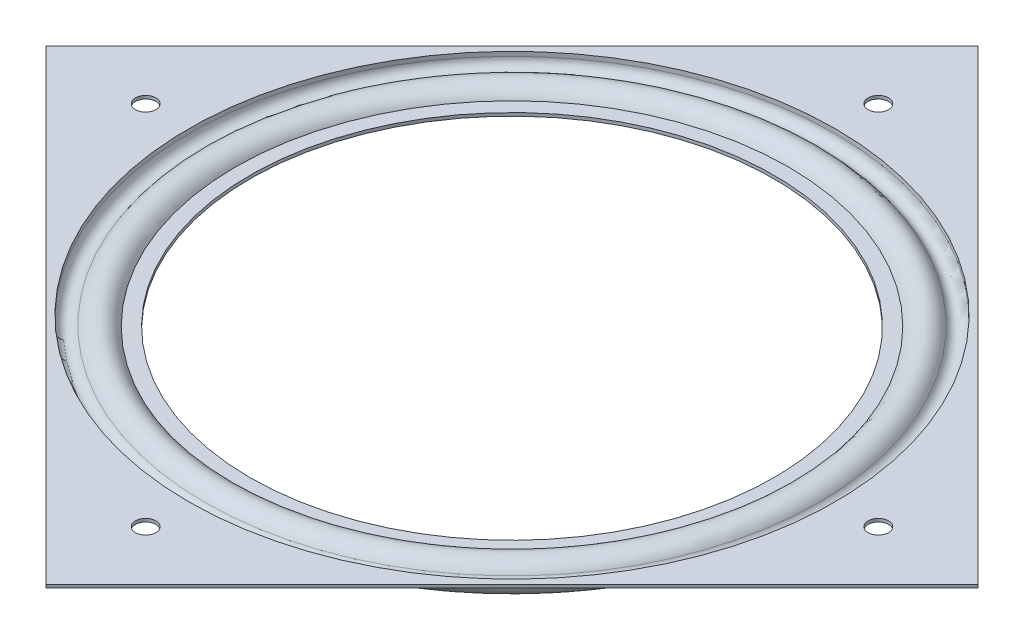
ISO-10303-21;
HEADER;
FILE_DESCRIPTION(('STEP AP214'),'2;1');
FILE_NAME('part.step','',(''),(''),'','','');
FILE_SCHEMA(('AUTOMOTIVE_DESIGN { 1 0 10303 214 1 1 1 1 }'));
ENDSEC;
DATA;
#1=APPLICATION_CONTEXT('core data for automotive mechanical design processes');
#2=APPLICATION_PROTOCOL_DEFINITION('international standard','automotive_design',2000,#1);
#3=PRODUCT_CONTEXT('',#1,'mechanical');
#4=PRODUCT('Part','Part','',(#3));
#5=PRODUCT_RELATED_PRODUCT_CATEGORY('part','',(#4));
#6=PRODUCT_DEFINITION_FORMATION('','',#4);
#7=PRODUCT_DEFINITION_CONTEXT('part definition',#1,'design');
#8=PRODUCT_DEFINITION('design','',#6,#7);
#9=PRODUCT_DEFINITION_SHAPE('','',#8);
#10=(LENGTH_UNIT() NAMED_UNIT(*) SI_UNIT(.MILLI.,.METRE.));
#11=(NAMED_UNIT(*) PLANE_ANGLE_UNIT() SI_UNIT($,.RADIAN.));
#12=(NAMED_UNIT(*) SI_UNIT($,.STERADIAN.) SOLID_ANGLE_UNIT());
#13=UNCERTAINTY_MEASURE_WITH_UNIT(LENGTH_MEASURE(1.E-05),#10,'distance_accuracy_value','');
#14=(GEOMETRIC_REPRESENTATION_CONTEXT(3) GLOBAL_UNCERTAINTY_ASSIGNED_CONTEXT((#13)) GLOBAL_UNIT_ASSIGNED_CONTEXT((#10,
#11,#12)) REPRESENTATION_CONTEXT('',''));
#15=CARTESIAN_POINT('',(0.,0.,0.));
#16=DIRECTION('',(0.,0.,1.));
#17=DIRECTION('',(1.,0.,0.));
#18=AXIS2_PLACEMENT_3D('',#15,#16,#17);
#19=CARTESIAN_POINT('',(75.5293408614699,2.5654,0.));
#20=DIRECTION('',(0.,1.,0.));
#21=DIRECTION('',(0.,0.,1.));
#22=AXIS2_PLACEMENT_3D('',#19,#20,#21);
#23=PLANE('',#22);
#24=CARTESIAN_POINT('',(85.5998013460312,2.5654,0.));
#25=DIRECTION('',(0.,1.,0.));
#26=DIRECTION('',(0.,0.,1.));
#27=AXIS2_PLACEMENT_3D('',#24,#25,#26);
#28=CIRCLE('',#27,2.3876);
#29=CARTESIAN_POINT('',(85.5998013460312,2.5654,2.38760000000001));
#30=VERTEX_POINT('',#29);
#31=EDGE_CURVE('E147',#30,#30,#28,.T.);
#32=ORIENTED_EDGE('',*,*,#31,.T.);
#33=EDGE_LOOP('',(#32));
#34=FACE_BOUND('',#33,.T.);
#35=CARTESIAN_POINT('',(0.,2.5654,-85.5998013460312));
#36=DIRECTION('',(0.,1.,0.));
#37=DIRECTION('',(0.,0.,1.));
#38=AXIS2_PLACEMENT_3D('',#35,#36,#37);
#39=CIRCLE('',#38,2.3876);
#40=CARTESIAN_POINT('',(0.,2.5654,-83.2122013460312));
#41=VERTEX_POINT('',#40);
#42=EDGE_CURVE('E151',#41,#41,#39,.T.);
#43=ORIENTED_EDGE('',*,*,#42,.T.);
#44=EDGE_LOOP('',(#43));
#45=FACE_BOUND('',#44,.T.);
#46=CARTESIAN_POINT('',(-85.5998013460312,2.5654,0.));
#47=DIRECTION('',(0.,1.,0.));
#48=DIRECTION('',(0.,0.,1.));
#49=AXIS2_PLACEMENT_3D('',#46,#47,#48);
#50=CIRCLE('',#49,2.3876);
#51=CARTESIAN_POINT('',(-85.5998013460312,2.5654,2.3876));
#52=VERTEX_POINT('',#51);
#53=EDGE_CURVE('E155',#52,#52,#50,.T.);
#54=ORIENTED_EDGE('',*,*,#53,.T.);
#55=EDGE_LOOP('',(#54));
#56=FACE_BOUND('',#55,.T.);
#57=CARTESIAN_POINT('',(0.,2.5654,85.5998013460312));
#58=DIRECTION('',(0.,1.,0.));
#59=DIRECTION('',(0.,0.,1.));
#60=AXIS2_PLACEMENT_3D('',#57,#58,#59);
#61=CIRCLE('',#60,2.3876);
#62=CARTESIAN_POINT('',(0.,2.5654,87.9874013460312));
#63=VERTEX_POINT('',#62);
#64=EDGE_CURVE('E78',#63,#63,#61,.T.);
#65=ORIENTED_EDGE('',*,*,#64,.T.);
#66=EDGE_LOOP('',(#65));
#67=FACE_BOUND('',#66,.T.);
#68=DIRECTION('',(-0.707106781186548,0.,0.707106781186547));
#69=VECTOR('',#68,1.);
#70=CARTESIAN_POINT('',(108.894585724085,2.5654,0.));
#71=LINE('',#70,#69);
#72=CARTESIAN_POINT('',(108.894585724085,2.5654,0.));
#73=VERTEX_POINT('',#72);
#74=CARTESIAN_POINT('',(0.,2.5654,108.894585724085));
#75=VERTEX_POINT('',#74);
#76=EDGE_CURVE('E47',#73,#75,#71,.T.);
#77=ORIENTED_EDGE('',*,*,#76,.T.);
#78=DIRECTION('',(-0.707106781186547,0.,-0.707106781186548));
#79=VECTOR('',#78,1.);
#80=CARTESIAN_POINT('',(-108.894585724085,2.5654,0.));
#81=LINE('',#80,#79);
#82=CARTESIAN_POINT('',(-108.894585724085,2.5654,0.));
#83=VERTEX_POINT('',#82);
#84=EDGE_CURVE('E357',#75,#83,#81,.T.);
#85=ORIENTED_EDGE('',*,*,#84,.T.);
#86=DIRECTION('',(0.707106781186547,0.,-0.707106781186548));
#87=VECTOR('',#86,1.);
#88=CARTESIAN_POINT('',(0.,2.5654,-108.894585724085));
#89=LINE('',#88,#87);
#90=CARTESIAN_POINT('',(0.,2.5654,-108.894585724085));
#91=VERTEX_POINT('',#90);
#92=EDGE_CURVE('E103',#83,#91,#89,.T.);
#93=ORIENTED_EDGE('',*,*,#92,.T.);
#94=DIRECTION('',(0.707106781186548,0.,0.707106781186548));
#95=VECTOR('',#94,1.);
#96=CARTESIAN_POINT('',(0.,2.5654,-108.894585724085));
#97=LINE('',#96,#95);
#98=EDGE_CURVE('E92',#91,#73,#97,.T.);
#99=ORIENTED_EDGE('',*,*,#98,.T.);
#100=EDGE_LOOP('',(#77,#85,#93,#99));
#101=FACE_BOUND('',#100,.T.);
#102=CARTESIAN_POINT('',(0.,2.56540000000001,0.));
#103=DIRECTION('',(0.,1.,0.));
#104=DIRECTION('',(0.,0.,1.));
#105=AXIS2_PLACEMENT_3D('',#102,#103,#104);
#106=CIRCLE('',#105,76.26594086147);
#107=CARTESIAN_POINT('',(0.,2.56540000000001,76.26594086147));
#108=VERTEX_POINT('',#107);
#109=EDGE_CURVE('E99',#108,#108,#106,.T.);
#110=ORIENTED_EDGE('',*,*,#109,.T.);
#111=EDGE_LOOP('',(#110));
#112=FACE_BOUND('',#111,.T.);
#113=ADVANCED_FACE('F32',(#34,#45,#56,#67,#101,#112),#23,.F.);
#114=CARTESIAN_POINT('',(75.5293408614699,3.302,0.));
#115=DIRECTION('',(0.,1.,0.));
#116=DIRECTION('',(0.,0.,1.));
#117=AXIS2_PLACEMENT_3D('',#114,#115,#116);
#118=PLANE('',#117);
#119=CARTESIAN_POINT('',(85.5998013460312,3.302,0.));
#120=DIRECTION('',(0.,1.,0.));
#121=DIRECTION('',(0.,0.,1.));
#122=AXIS2_PLACEMENT_3D('',#119,#120,#121);
#123=CIRCLE('',#122,2.3876);
#124=CARTESIAN_POINT('',(85.5998013460312,3.302,2.38760000000001));
#125=VERTEX_POINT('',#124);
#126=EDGE_CURVE('E339',#125,#125,#123,.T.);
#127=ORIENTED_EDGE('',*,*,#126,.F.);
#128=EDGE_LOOP('',(#127));
#129=FACE_BOUND('',#128,.T.);
#130=CARTESIAN_POINT('',(0.,3.302,-85.5998013460312));
#131=DIRECTION('',(0.,1.,0.));
#132=DIRECTION('',(0.,0.,1.));
#133=AXIS2_PLACEMENT_3D('',#130,#131,#132);
#134=CIRCLE('',#133,2.3876);
#135=CARTESIAN_POINT('',(0.,3.302,-83.2122013460312));
#136=VERTEX_POINT('',#135);
#137=EDGE_CURVE('E340',#136,#136,#134,.T.);
#138=ORIENTED_EDGE('',*,*,#137,.F.);
#139=EDGE_LOOP('',(#138));
#140=FACE_BOUND('',#139,.T.);
#141=CARTESIAN_POINT('',(-85.5998013460312,3.302,0.));
#142=DIRECTION('',(0.,1.,0.));
#143=DIRECTION('',(0.,0.,1.));
#144=AXIS2_PLACEMENT_3D('',#141,#142,#143);
#145=CIRCLE('',#144,2.3876);
#146=CARTESIAN_POINT('',(-85.5998013460312,3.302,2.3876));
#147=VERTEX_POINT('',#146);
#148=EDGE_CURVE('E347',#147,#147,#145,.T.);
#149=ORIENTED_EDGE('',*,*,#148,.F.);
#150=EDGE_LOOP('',(#149));
#151=FACE_BOUND('',#150,.T.);
#152=CARTESIAN_POINT('',(0.,3.302,85.5998013460312));
#153=DIRECTION('',(0.,1.,0.));
#154=DIRECTION('',(0.,0.,1.));
#155=AXIS2_PLACEMENT_3D('',#152,#153,#154);
#156=CIRCLE('',#155,2.3876);
#157=CARTESIAN_POINT('',(0.,3.302,87.9874013460312));
#158=VERTEX_POINT('',#157);
#159=EDGE_CURVE('E351',#158,#158,#156,.T.);
#160=ORIENTED_EDGE('',*,*,#159,.F.);
#161=EDGE_LOOP('',(#160));
#162=FACE_BOUND('',#161,.T.);
#163=DIRECTION('',(-0.707106781186548,0.,-0.707106781186548));
#164=VECTOR('',#163,1.);
#165=CARTESIAN_POINT('',(0.,3.302,-108.894585724085));
#166=LINE('',#165,#164);
#167=CARTESIAN_POINT('',(108.894585724085,3.302,0.));
#168=VERTEX_POINT('',#167);
#169=CARTESIAN_POINT('',(0.,3.302,-108.894585724085));
#170=VERTEX_POINT('',#169);
#171=EDGE_CURVE('E66',#168,#170,#166,.T.);
#172=ORIENTED_EDGE('',*,*,#171,.T.);
#173=DIRECTION('',(-0.707106781186547,0.,0.707106781186548));
#174=VECTOR('',#173,1.);
#175=CARTESIAN_POINT('',(0.,3.302,-108.894585724085));
#176=LINE('',#175,#174);
#177=CARTESIAN_POINT('',(-108.894585724085,3.302,0.));
#178=VERTEX_POINT('',#177);
#179=EDGE_CURVE('E70',#170,#178,#176,.T.);
#180=ORIENTED_EDGE('',*,*,#179,.T.);
#181=DIRECTION('',(0.707106781186548,0.,0.707106781186548));
#182=VECTOR('',#181,1.);
#183=CARTESIAN_POINT('',(-108.894585724085,3.302,0.));
#184=LINE('',#183,#182);
#185=CARTESIAN_POINT('',(0.,3.302,108.894585724085));
#186=VERTEX_POINT('',#185);
#187=EDGE_CURVE('E88',#178,#186,#184,.T.);
#188=ORIENTED_EDGE('',*,*,#187,.T.);
#189=DIRECTION('',(0.707106781186548,0.,-0.707106781186547));
#190=VECTOR('',#189,1.);
#191=CARTESIAN_POINT('',(108.894585724085,3.302,0.));
#192=LINE('',#191,#190);
#193=EDGE_CURVE('E73',#186,#168,#192,.T.);
#194=ORIENTED_EDGE('',*,*,#193,.T.);
#195=EDGE_LOOP('',(#172,#180,#188,#194));
#196=FACE_BOUND('',#195,.T.);
#197=CARTESIAN_POINT('',(0.,3.30200000000001,0.));
#198=DIRECTION('',(0.,1.,0.));
#199=DIRECTION('',(0.,0.,1.));
#200=AXIS2_PLACEMENT_3D('',#197,#198,#199);
#201=CIRCLE('',#200,75.5293408614699);
#202=CARTESIAN_POINT('',(0.,3.30200000000001,75.5293408614699));
#203=VERTEX_POINT('',#202);
#204=EDGE_CURVE('E11',#203,#203,#201,.T.);
#205=ORIENTED_EDGE('',*,*,#204,.F.);
#206=EDGE_LOOP('',(#205));
#207=FACE_BOUND('',#206,.T.);
#208=ADVANCED_FACE('F68',(#129,#140,#151,#162,#196,#207),#118,.T.);
#209=CARTESIAN_POINT('',(0.,21.7127262600922,0.));
#210=DIRECTION('',(0.,1.,0.));
#211=DIRECTION('',(0.,0.,1.));
#212=AXIS2_PLACEMENT_3D('',#209,#210,#211);
#213=CYLINDRICAL_SURFACE('',#212,75.5293408614699);
#214=ORIENTED_EDGE('',*,*,#204,.T.);
#215=EDGE_LOOP('',(#214));
#216=FACE_BOUND('',#215,.T.);
#217=CARTESIAN_POINT('',(0.,2.28599999999999,0.));
#218=DIRECTION('',(0.,1.,0.));
#219=DIRECTION('',(0.,0.,1.));
#220=AXIS2_PLACEMENT_3D('',#217,#218,#219);
#221=CIRCLE('',#220,75.5293408614699);
#222=CARTESIAN_POINT('',(0.,2.28599999999999,75.5293408614699));
#223=VERTEX_POINT('',#222);
#224=EDGE_CURVE('E40',#223,#223,#221,.T.);
#225=ORIENTED_EDGE('',*,*,#224,.F.);
#226=EDGE_LOOP('',(#225));
#227=FACE_BOUND('',#226,.T.);
#228=ADVANCED_FACE('F129',(#216,#227),#213,.F.);
#229=CARTESIAN_POINT('',(0.,2.28599999999999,0.));
#230=DIRECTION('',(0.,1.,0.));
#231=DIRECTION('',(0.,0.,1.));
#232=AXIS2_PLACEMENT_3D('',#229,#230,#231);
#233=TOROIDAL_SURFACE('',#232,73.49734086147,2.032);
#234=ORIENTED_EDGE('',*,*,#224,.T.);
#235=EDGE_LOOP('',(#234));
#236=FACE_BOUND('',#235,.T.);
#237=CARTESIAN_POINT('',(0.,1.26999999999999,0.));
#238=DIRECTION('',(0.,1.,0.));
#239=DIRECTION('',(0.,0.,1.));
#240=AXIS2_PLACEMENT_3D('',#237,#238,#239);
#241=CIRCLE('',#240,71.73757724098);
#242=CARTESIAN_POINT('',(0.,1.26999999999999,71.73757724098));
#243=VERTEX_POINT('',#242);
#244=EDGE_CURVE('E121',#243,#243,#241,.T.);
#245=ORIENTED_EDGE('',*,*,#244,.F.);
#246=EDGE_LOOP('',(#245));
#247=FACE_BOUND('',#246,.T.);
#248=ADVANCED_FACE('F126',(#236,#247),#233,.F.);
#249=CARTESIAN_POINT('',(0.,-0.761999999999995,0.));
#250=DIRECTION('',(0.,1.,0.));
#251=DIRECTION('',(0.,0.,1.));
#252=AXIS2_PLACEMENT_3D('',#249,#250,#251);
#253=TOROIDAL_SURFACE('',#252,68.21805,4.064);
#254=ORIENTED_EDGE('',*,*,#244,.T.);
#255=EDGE_LOOP('',(#254));
#256=FACE_BOUND('',#255,.T.);
#257=CARTESIAN_POINT('',(0.,1.0414,0.));
#258=DIRECTION('',(0.,1.,0.));
#259=DIRECTION('',(0.,0.,1.));
#260=AXIS2_PLACEMENT_3D('',#257,#258,#259);
#261=CIRCLE('',#260,64.5760938717634);
#262=CARTESIAN_POINT('',(0.,1.0414,64.5760938717634));
#263=VERTEX_POINT('',#262);
#264=EDGE_CURVE('E118',#263,#263,#261,.T.);
#265=ORIENTED_EDGE('',*,*,#264,.F.);
#266=EDGE_LOOP('',(#265));
#267=FACE_BOUND('',#266,.T.);
#268=ADVANCED_FACE('F137',(#256,#267),#253,.T.);
#269=CARTESIAN_POINT('',(61.214,1.0414,0.));
#270=DIRECTION('',(0.,1.,0.));
#271=DIRECTION('',(0.,0.,1.));
#272=AXIS2_PLACEMENT_3D('',#269,#270,#271);
#273=PLANE('',#272);
#274=ORIENTED_EDGE('',*,*,#264,.T.);
#275=EDGE_LOOP('',(#274));
#276=FACE_BOUND('',#275,.T.);
#277=CARTESIAN_POINT('',(0.,1.0414,0.));
#278=DIRECTION('',(0.,1.,0.));
#279=DIRECTION('',(0.,0.,1.));
#280=AXIS2_PLACEMENT_3D('',#277,#278,#279);
#281=CIRCLE('',#280,61.214);
#282=CARTESIAN_POINT('',(0.,1.0414,61.214));
#283=VERTEX_POINT('',#282);
#284=EDGE_CURVE('E115',#283,#283,#281,.T.);
#285=ORIENTED_EDGE('',*,*,#284,.F.);
#286=EDGE_LOOP('',(#285));
#287=FACE_BOUND('',#286,.T.);
#288=ADVANCED_FACE('F187',(#276,#287),#273,.T.);
#289=CARTESIAN_POINT('',(0.,21.7127262600922,0.));
#290=DIRECTION('',(0.,1.,0.));
#291=DIRECTION('',(0.,0.,1.));
#292=AXIS2_PLACEMENT_3D('',#289,#290,#291);
#293=CYLINDRICAL_SURFACE('',#292,61.214);
#294=ORIENTED_EDGE('',*,*,#284,.T.);
#295=EDGE_LOOP('',(#294));
#296=FACE_BOUND('',#295,.T.);
#297=CARTESIAN_POINT('',(0.,0.304800000000001,0.));
#298=DIRECTION('',(0.,1.,0.));
#299=DIRECTION('',(0.,0.,1.));
#300=AXIS2_PLACEMENT_3D('',#297,#298,#299);
#301=CIRCLE('',#300,61.214);
#302=CARTESIAN_POINT('',(0.,0.304800000000001,61.214));
#303=VERTEX_POINT('',#302);
#304=EDGE_CURVE('E112',#303,#303,#301,.T.);
#305=ORIENTED_EDGE('',*,*,#304,.F.);
#306=EDGE_LOOP('',(#305));
#307=FACE_BOUND('',#306,.T.);
#308=ADVANCED_FACE('F182',(#296,#307),#293,.F.);
#309=CARTESIAN_POINT('',(61.214,0.304800000000002,0.));
#310=DIRECTION('',(0.,1.,0.));
#311=DIRECTION('',(0.,0.,1.));
#312=AXIS2_PLACEMENT_3D('',#309,#310,#311);
#313=PLANE('',#312);
#314=CARTESIAN_POINT('',(0.,0.304800000000001,0.));
#315=DIRECTION('',(0.,1.,0.));
#316=DIRECTION('',(0.,0.,1.));
#317=AXIS2_PLACEMENT_3D('',#314,#315,#316);
#318=CIRCLE('',#317,65.0662999274213);
#319=CARTESIAN_POINT('',(0.,0.304800000000001,65.0662999274213));
#320=VERTEX_POINT('',#319);
#321=EDGE_CURVE('E109',#320,#320,#318,.T.);
#322=ORIENTED_EDGE('',*,*,#321,.F.);
#323=EDGE_LOOP('',(#322));
#324=FACE_BOUND('',#323,.T.);
#325=ORIENTED_EDGE('',*,*,#304,.T.);
#326=EDGE_LOOP('',(#325));
#327=FACE_BOUND('',#326,.T.);
#328=ADVANCED_FACE('F176',(#324,#327),#313,.F.);
#329=CARTESIAN_POINT('',(0.,-0.761999999999995,0.));
#330=DIRECTION('',(0.,1.,0.));
#331=DIRECTION('',(0.,0.,1.));
#332=AXIS2_PLACEMENT_3D('',#329,#330,#331);
#333=TOROIDAL_SURFACE('',#332,68.21805,3.3274);
#334=CARTESIAN_POINT('',(0.,0.901699999999995,0.));
#335=DIRECTION('',(0.,1.,0.));
#336=DIRECTION('',(0.,0.,1.));
#337=AXIS2_PLACEMENT_3D('',#334,#335,#336);
#338=CIRCLE('',#337,71.0996629285523);
#339=CARTESIAN_POINT('',(0.,0.901699999999995,71.0996629285523));
#340=VERTEX_POINT('',#339);
#341=EDGE_CURVE('E106',#340,#340,#338,.T.);
#342=ORIENTED_EDGE('',*,*,#341,.F.);
#343=EDGE_LOOP('',(#342));
#344=FACE_BOUND('',#343,.T.);
#345=ORIENTED_EDGE('',*,*,#321,.T.);
#346=EDGE_LOOP('',(#345));
#347=FACE_BOUND('',#346,.T.);
#348=ADVANCED_FACE('F170',(#344,#347),#333,.F.);
#349=CARTESIAN_POINT('',(0.,2.28599999999999,0.));
#350=DIRECTION('',(0.,1.,0.));
#351=DIRECTION('',(0.,0.,1.));
#352=AXIS2_PLACEMENT_3D('',#349,#350,#351);
#353=TOROIDAL_SURFACE('',#352,73.49734086147,2.7686);
#354=CARTESIAN_POINT('',(0.,2.28599999999999,0.));
#355=DIRECTION('',(0.,1.,0.));
#356=DIRECTION('',(0.,0.,1.));
#357=AXIS2_PLACEMENT_3D('',#354,#355,#356);
#358=CIRCLE('',#357,76.26594086147);
#359=CARTESIAN_POINT('',(0.,2.28599999999999,76.26594086147));
#360=VERTEX_POINT('',#359);
#361=EDGE_CURVE('E102',#360,#360,#358,.T.);
#362=ORIENTED_EDGE('',*,*,#361,.F.);
#363=EDGE_LOOP('',(#362));
#364=FACE_BOUND('',#363,.T.);
#365=ORIENTED_EDGE('',*,*,#341,.T.);
#366=EDGE_LOOP('',(#365));
#367=FACE_BOUND('',#366,.T.);
#368=ADVANCED_FACE('F164',(#364,#367),#353,.T.);
#369=CARTESIAN_POINT('',(0.,21.7127262600922,0.));
#370=DIRECTION('',(0.,1.,0.));
#371=DIRECTION('',(0.,0.,1.));
#372=AXIS2_PLACEMENT_3D('',#369,#370,#371);
#373=CYLINDRICAL_SURFACE('',#372,76.26594086147);
#374=ORIENTED_EDGE('',*,*,#109,.F.);
#375=EDGE_LOOP('',(#374));
#376=FACE_BOUND('',#375,.T.);
#377=ORIENTED_EDGE('',*,*,#361,.T.);
#378=EDGE_LOOP('',(#377));
#379=FACE_BOUND('',#378,.T.);
#380=ADVANCED_FACE('F161',(#376,#379),#373,.T.);
#381=CARTESIAN_POINT('',(0.,-305.435,-108.894585724085));
#382=DIRECTION('',(-0.707106781186548,0.,-0.707106781186547));
#383=DIRECTION('',(-0.707106781186547,0.,0.707106781186548));
#384=AXIS2_PLACEMENT_3D('',#381,#382,#383);
#385=PLANE('',#384);
#386=DIRECTION('',(0.,1.,0.));
#387=VECTOR('',#386,1.);
#388=CARTESIAN_POINT('',(0.,-305.435,-108.894585724085));
#389=LINE('',#388,#387);
#390=EDGE_CURVE('E84',#91,#170,#389,.T.);
#391=ORIENTED_EDGE('',*,*,#390,.F.);
#392=ORIENTED_EDGE('',*,*,#92,.F.);
#393=DIRECTION('',(0.,1.,0.));
#394=VECTOR('',#393,1.);
#395=CARTESIAN_POINT('',(-108.894585724085,-305.435,0.));
#396=LINE('',#395,#394);
#397=EDGE_CURVE('E86',#83,#178,#396,.T.);
#398=ORIENTED_EDGE('',*,*,#397,.T.);
#399=ORIENTED_EDGE('',*,*,#179,.F.);
#400=EDGE_LOOP('',(#391,#392,#398,#399));
#401=FACE_BOUND('',#400,.T.);
#402=ADVANCED_FACE('F82',(#401),#385,.T.);
#403=CARTESIAN_POINT('',(-108.894585724085,-305.435,0.));
#404=DIRECTION('',(-0.707106781186548,0.,0.707106781186547));
#405=DIRECTION('',(0.707106781186547,0.,0.707106781186548));
#406=AXIS2_PLACEMENT_3D('',#403,#404,#405);
#407=PLANE('',#406);
#408=ORIENTED_EDGE('',*,*,#84,.F.);
#409=DIRECTION('',(0.,1.,0.));
#410=VECTOR('',#409,1.);
#411=CARTESIAN_POINT('',(0.,-305.435,108.894585724085));
#412=LINE('',#411,#410);
#413=EDGE_CURVE('E94',#75,#186,#412,.T.);
#414=ORIENTED_EDGE('',*,*,#413,.T.);
#415=ORIENTED_EDGE('',*,*,#187,.F.);
#416=ORIENTED_EDGE('',*,*,#397,.F.);
#417=EDGE_LOOP('',(#408,#414,#415,#416));
#418=FACE_BOUND('',#417,.T.);
#419=ADVANCED_FACE('F255',(#418),#407,.T.);
#420=CARTESIAN_POINT('',(108.894585724085,-305.435,0.));
#421=DIRECTION('',(0.707106781186547,0.,0.707106781186548));
#422=DIRECTION('',(0.707106781186548,0.,-0.707106781186547));
#423=AXIS2_PLACEMENT_3D('',#420,#421,#422);
#424=PLANE('',#423);
#425=ORIENTED_EDGE('',*,*,#413,.F.);
#426=ORIENTED_EDGE('',*,*,#76,.F.);
#427=DIRECTION('',(0.,1.,0.));
#428=VECTOR('',#427,1.);
#429=CARTESIAN_POINT('',(108.894585724085,-305.435,0.));
#430=LINE('',#429,#428);
#431=EDGE_CURVE('E359',#73,#168,#430,.T.);
#432=ORIENTED_EDGE('',*,*,#431,.T.);
#433=ORIENTED_EDGE('',*,*,#193,.F.);
#434=EDGE_LOOP('',(#425,#426,#432,#433));
#435=FACE_BOUND('',#434,.T.);
#436=ADVANCED_FACE('F265',(#435),#424,.T.);
#437=CARTESIAN_POINT('',(0.,-305.435,-108.894585724085));
#438=DIRECTION('',(0.707106781186548,0.,-0.707106781186548));
#439=DIRECTION('',(-0.707106781186548,0.,-0.707106781186548));
#440=AXIS2_PLACEMENT_3D('',#437,#438,#439);
#441=PLANE('',#440);
#442=ORIENTED_EDGE('',*,*,#431,.F.);
#443=ORIENTED_EDGE('',*,*,#98,.F.);
#444=ORIENTED_EDGE('',*,*,#390,.T.);
#445=ORIENTED_EDGE('',*,*,#171,.F.);
#446=EDGE_LOOP('',(#442,#443,#444,#445));
#447=FACE_BOUND('',#446,.T.);
#448=ADVANCED_FACE('F91',(#447),#441,.T.);
#449=CARTESIAN_POINT('',(0.,3.302,85.5998013460312));
#450=DIRECTION('',(0.,1.,0.));
#451=DIRECTION('',(0.,0.,1.));
#452=AXIS2_PLACEMENT_3D('',#449,#450,#451);
#453=CYLINDRICAL_SURFACE('',#452,2.3876);
#454=ORIENTED_EDGE('',*,*,#159,.T.);
#455=EDGE_LOOP('',(#454));
#456=FACE_BOUND('',#455,.T.);
#457=ORIENTED_EDGE('',*,*,#64,.F.);
#458=EDGE_LOOP('',(#457));
#459=FACE_BOUND('',#458,.T.);
#460=ADVANCED_FACE('F283',(#456,#459),#453,.F.);
#461=CARTESIAN_POINT('',(-85.5998013460312,3.302,0.));
#462=DIRECTION('',(0.,1.,0.));
#463=DIRECTION('',(0.,0.,1.));
#464=AXIS2_PLACEMENT_3D('',#461,#462,#463);
#465=CYLINDRICAL_SURFACE('',#464,2.3876);
#466=ORIENTED_EDGE('',*,*,#148,.T.);
#467=EDGE_LOOP('',(#466));
#468=FACE_BOUND('',#467,.T.);
#469=ORIENTED_EDGE('',*,*,#53,.F.);
#470=EDGE_LOOP('',(#469));
#471=FACE_BOUND('',#470,.T.);
#472=ADVANCED_FACE('F302',(#468,#471),#465,.F.);
#473=CARTESIAN_POINT('',(0.,3.302,-85.5998013460312));
#474=DIRECTION('',(0.,1.,0.));
#475=DIRECTION('',(0.,0.,1.));
#476=AXIS2_PLACEMENT_3D('',#473,#474,#475);
#477=CYLINDRICAL_SURFACE('',#476,2.3876);
#478=ORIENTED_EDGE('',*,*,#137,.T.);
#479=EDGE_LOOP('',(#478));
#480=FACE_BOUND('',#479,.T.);
#481=ORIENTED_EDGE('',*,*,#42,.F.);
#482=EDGE_LOOP('',(#481));
#483=FACE_BOUND('',#482,.T.);
#484=ADVANCED_FACE('F312',(#480,#483),#477,.F.);
#485=CARTESIAN_POINT('',(85.5998013460312,3.302,0.));
#486=DIRECTION('',(0.,1.,0.));
#487=DIRECTION('',(0.,0.,1.));
#488=AXIS2_PLACEMENT_3D('',#485,#486,#487);
#489=CYLINDRICAL_SURFACE('',#488,2.3876);
#490=ORIENTED_EDGE('',*,*,#126,.T.);
#491=EDGE_LOOP('',(#490));
#492=FACE_BOUND('',#491,.T.);
#493=ORIENTED_EDGE('',*,*,#31,.F.);
#494=EDGE_LOOP('',(#493));
#495=FACE_BOUND('',#494,.T.);
#496=ADVANCED_FACE('F322',(#492,#495),#489,.F.);
#497=CLOSED_SHELL('',(#113,#208,#228,#248,#268,#288,#308,#328,#348,#368,#380,#402,#419,#436,
#448,#460,#472,#484,#496));
#498=MANIFOLD_SOLID_BREP('B2',#497);
#499=ADVANCED_BREP_SHAPE_REPRESENTATION('',(#18,#498),#14);
#500=SHAPE_DEFINITION_REPRESENTATION(#9,#499);
ENDSEC;
END-ISO-10303-21;
